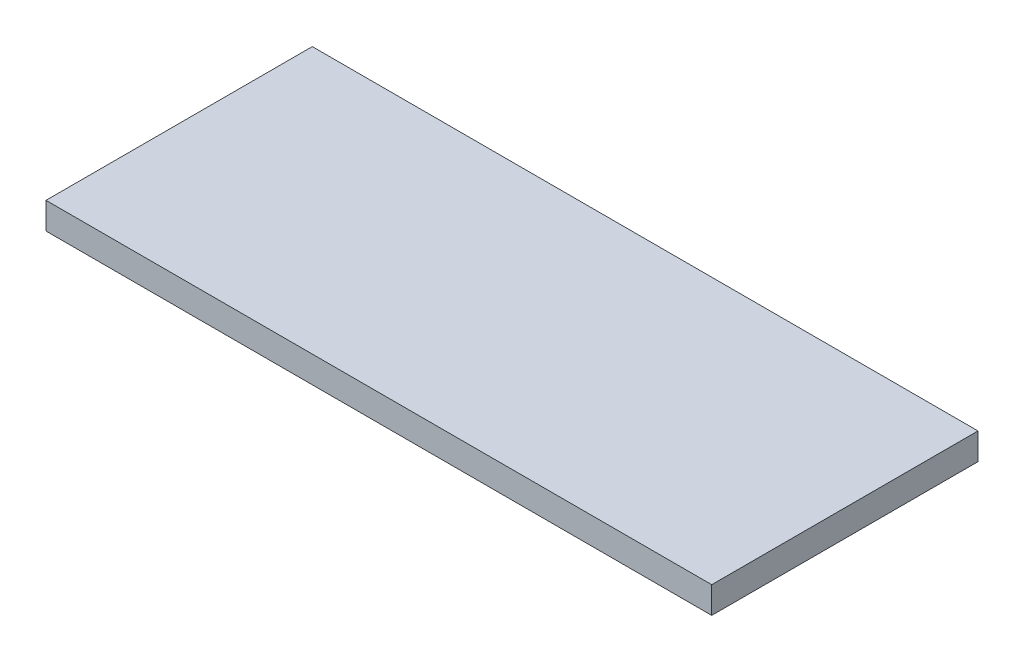
ISO-10303-21;
HEADER;
FILE_DESCRIPTION(('STEP AP214'),'2;1');
FILE_NAME('part.step','',(''),(''),'','','');
FILE_SCHEMA(('AUTOMOTIVE_DESIGN { 1 0 10303 214 1 1 1 1 }'));
ENDSEC;
DATA;
#1=APPLICATION_CONTEXT('core data for automotive mechanical design processes');
#2=APPLICATION_PROTOCOL_DEFINITION('international standard','automotive_design',2000,#1);
#3=PRODUCT_CONTEXT('',#1,'mechanical');
#4=PRODUCT('Part','Part','',(#3));
#5=PRODUCT_RELATED_PRODUCT_CATEGORY('part','',(#4));
#6=PRODUCT_DEFINITION_FORMATION('','',#4);
#7=PRODUCT_DEFINITION_CONTEXT('part definition',#1,'design');
#8=PRODUCT_DEFINITION('design','',#6,#7);
#9=PRODUCT_DEFINITION_SHAPE('','',#8);
#10=(LENGTH_UNIT() NAMED_UNIT(*) SI_UNIT(.MILLI.,.METRE.));
#11=(NAMED_UNIT(*) PLANE_ANGLE_UNIT() SI_UNIT($,.RADIAN.));
#12=(NAMED_UNIT(*) SI_UNIT($,.STERADIAN.) SOLID_ANGLE_UNIT());
#13=UNCERTAINTY_MEASURE_WITH_UNIT(LENGTH_MEASURE(1.E-05),#10,'distance_accuracy_value','');
#14=(GEOMETRIC_REPRESENTATION_CONTEXT(3) GLOBAL_UNCERTAINTY_ASSIGNED_CONTEXT((#13)) GLOBAL_UNIT_ASSIGNED_CONTEXT((#10,
#11,#12)) REPRESENTATION_CONTEXT('',''));
#15=CARTESIAN_POINT('',(0.,0.,0.));
#16=DIRECTION('',(0.,0.,1.));
#17=DIRECTION('',(1.,0.,0.));
#18=AXIS2_PLACEMENT_3D('',#15,#16,#17);
#19=CARTESIAN_POINT('',(25.,2.,10.));
#20=DIRECTION('',(-1.,0.,0.));
#21=DIRECTION('',(0.,0.,1.));
#22=AXIS2_PLACEMENT_3D('',#19,#20,#21);
#23=PLANE('',#22);
#24=DIRECTION('',(0.,0.,-1.));
#25=VECTOR('',#24,1.);
#26=CARTESIAN_POINT('',(25.,0.,10.));
#27=LINE('',#26,#25);
#28=CARTESIAN_POINT('',(25.,0.,10.));
#29=VERTEX_POINT('',#28);
#30=CARTESIAN_POINT('',(25.,0.,-10.));
#31=VERTEX_POINT('',#30);
#32=EDGE_CURVE('E107',#29,#31,#27,.T.);
#33=ORIENTED_EDGE('',*,*,#32,.T.);
#34=DIRECTION('',(0.,-1.,0.));
#35=VECTOR('',#34,1.);
#36=CARTESIAN_POINT('',(25.,2.,-10.));
#37=LINE('',#36,#35);
#38=CARTESIAN_POINT('',(25.,2.,-10.));
#39=VERTEX_POINT('',#38);
#40=EDGE_CURVE('E11',#39,#31,#37,.T.);
#41=ORIENTED_EDGE('',*,*,#40,.F.);
#42=DIRECTION('',(0.,0.,-1.));
#43=VECTOR('',#42,1.);
#44=CARTESIAN_POINT('',(25.,2.,10.));
#45=LINE('',#44,#43);
#46=CARTESIAN_POINT('',(25.,2.,10.));
#47=VERTEX_POINT('',#46);
#48=EDGE_CURVE('E91',#47,#39,#45,.T.);
#49=ORIENTED_EDGE('',*,*,#48,.F.);
#50=DIRECTION('',(0.,-1.,0.));
#51=VECTOR('',#50,1.);
#52=CARTESIAN_POINT('',(25.,2.,10.));
#53=LINE('',#52,#51);
#54=EDGE_CURVE('E103',#47,#29,#53,.T.);
#55=ORIENTED_EDGE('',*,*,#54,.T.);
#56=EDGE_LOOP('',(#33,#41,#49,#55));
#57=FACE_BOUND('',#56,.T.);
#58=ADVANCED_FACE('F39',(#57),#23,.F.);
#59=CARTESIAN_POINT('',(-25.,2.,-10.));
#60=DIRECTION('',(0.,0.,1.));
#61=DIRECTION('',(1.,0.,0.));
#62=AXIS2_PLACEMENT_3D('',#59,#60,#61);
#63=PLANE('',#62);
#64=DIRECTION('',(-1.,0.,0.));
#65=VECTOR('',#64,1.);
#66=CARTESIAN_POINT('',(-25.,0.,-10.));
#67=LINE('',#66,#65);
#68=CARTESIAN_POINT('',(-25.,0.,-10.));
#69=VERTEX_POINT('',#68);
#70=EDGE_CURVE('E96',#31,#69,#67,.T.);
#71=ORIENTED_EDGE('',*,*,#70,.T.);
#72=DIRECTION('',(0.,-1.,0.));
#73=VECTOR('',#72,1.);
#74=CARTESIAN_POINT('',(-25.,2.,-10.));
#75=LINE('',#74,#73);
#76=CARTESIAN_POINT('',(-25.,2.,-10.));
#77=VERTEX_POINT('',#76);
#78=EDGE_CURVE('E48',#77,#69,#75,.T.);
#79=ORIENTED_EDGE('',*,*,#78,.F.);
#80=DIRECTION('',(-1.,0.,0.));
#81=VECTOR('',#80,1.);
#82=CARTESIAN_POINT('',(-25.,2.,-10.));
#83=LINE('',#82,#81);
#84=EDGE_CURVE('E86',#39,#77,#83,.T.);
#85=ORIENTED_EDGE('',*,*,#84,.F.);
#86=ORIENTED_EDGE('',*,*,#40,.T.);
#87=EDGE_LOOP('',(#71,#79,#85,#86));
#88=FACE_BOUND('',#87,.T.);
#89=ADVANCED_FACE('F95',(#88),#63,.F.);
#90=CARTESIAN_POINT('',(-25.,2.,10.));
#91=DIRECTION('',(1.,0.,0.));
#92=DIRECTION('',(0.,0.,-1.));
#93=AXIS2_PLACEMENT_3D('',#90,#91,#92);
#94=PLANE('',#93);
#95=DIRECTION('',(0.,0.,1.));
#96=VECTOR('',#95,1.);
#97=CARTESIAN_POINT('',(-25.,0.,10.));
#98=LINE('',#97,#96);
#99=CARTESIAN_POINT('',(-25.,0.,10.));
#100=VERTEX_POINT('',#99);
#101=EDGE_CURVE('E73',#69,#100,#98,.T.);
#102=ORIENTED_EDGE('',*,*,#101,.T.);
#103=DIRECTION('',(0.,-1.,0.));
#104=VECTOR('',#103,1.);
#105=CARTESIAN_POINT('',(-25.,2.,10.));
#106=LINE('',#105,#104);
#107=CARTESIAN_POINT('',(-25.,2.,10.));
#108=VERTEX_POINT('',#107);
#109=EDGE_CURVE('E98',#108,#100,#106,.T.);
#110=ORIENTED_EDGE('',*,*,#109,.F.);
#111=DIRECTION('',(0.,0.,1.));
#112=VECTOR('',#111,1.);
#113=CARTESIAN_POINT('',(-25.,2.,10.));
#114=LINE('',#113,#112);
#115=EDGE_CURVE('E89',#77,#108,#114,.T.);
#116=ORIENTED_EDGE('',*,*,#115,.F.);
#117=ORIENTED_EDGE('',*,*,#78,.T.);
#118=EDGE_LOOP('',(#102,#110,#116,#117));
#119=FACE_BOUND('',#118,.T.);
#120=ADVANCED_FACE('F99',(#119),#94,.F.);
#121=CARTESIAN_POINT('',(-25.,2.,10.));
#122=DIRECTION('',(0.,0.,-1.));
#123=DIRECTION('',(-1.,0.,0.));
#124=AXIS2_PLACEMENT_3D('',#121,#122,#123);
#125=PLANE('',#124);
#126=DIRECTION('',(1.,0.,0.));
#127=VECTOR('',#126,1.);
#128=CARTESIAN_POINT('',(-25.,0.,10.));
#129=LINE('',#128,#127);
#130=EDGE_CURVE('E79',#100,#29,#129,.T.);
#131=ORIENTED_EDGE('',*,*,#130,.T.);
#132=ORIENTED_EDGE('',*,*,#54,.F.);
#133=DIRECTION('',(1.,0.,0.));
#134=VECTOR('',#133,1.);
#135=CARTESIAN_POINT('',(-25.,2.,10.));
#136=LINE('',#135,#134);
#137=EDGE_CURVE('E56',#108,#47,#136,.T.);
#138=ORIENTED_EDGE('',*,*,#137,.F.);
#139=ORIENTED_EDGE('',*,*,#109,.T.);
#140=EDGE_LOOP('',(#131,#132,#138,#139));
#141=FACE_BOUND('',#140,.T.);
#142=ADVANCED_FACE('F120',(#141),#125,.F.);
#143=CARTESIAN_POINT('',(0.,2.,0.));
#144=DIRECTION('',(0.,-1.,0.));
#145=DIRECTION('',(0.,0.,-1.));
#146=AXIS2_PLACEMENT_3D('',#143,#144,#145);
#147=PLANE('',#146);
#148=ORIENTED_EDGE('',*,*,#48,.T.);
#149=ORIENTED_EDGE('',*,*,#84,.T.);
#150=ORIENTED_EDGE('',*,*,#115,.T.);
#151=ORIENTED_EDGE('',*,*,#137,.T.);
#152=EDGE_LOOP('',(#148,#149,#150,#151));
#153=FACE_BOUND('',#152,.T.);
#154=ADVANCED_FACE('F87',(#153),#147,.F.);
#155=CARTESIAN_POINT('',(0.,0.,0.));
#156=DIRECTION('',(0.,-1.,0.));
#157=DIRECTION('',(0.,0.,-1.));
#158=AXIS2_PLACEMENT_3D('',#155,#156,#157);
#159=PLANE('',#158);
#160=ORIENTED_EDGE('',*,*,#32,.F.);
#161=ORIENTED_EDGE('',*,*,#130,.F.);
#162=ORIENTED_EDGE('',*,*,#101,.F.);
#163=ORIENTED_EDGE('',*,*,#70,.F.);
#164=EDGE_LOOP('',(#160,#161,#162,#163));
#165=FACE_BOUND('',#164,.T.);
#166=ADVANCED_FACE('F123',(#165),#159,.T.);
#167=CLOSED_SHELL('',(#58,#89,#120,#142,#154,#166));
#168=MANIFOLD_SOLID_BREP('B2',#167);
#169=ADVANCED_BREP_SHAPE_REPRESENTATION('',(#18,#168),#14);
#170=SHAPE_DEFINITION_REPRESENTATION(#9,#169);
ENDSEC;
END-ISO-10303-21;
